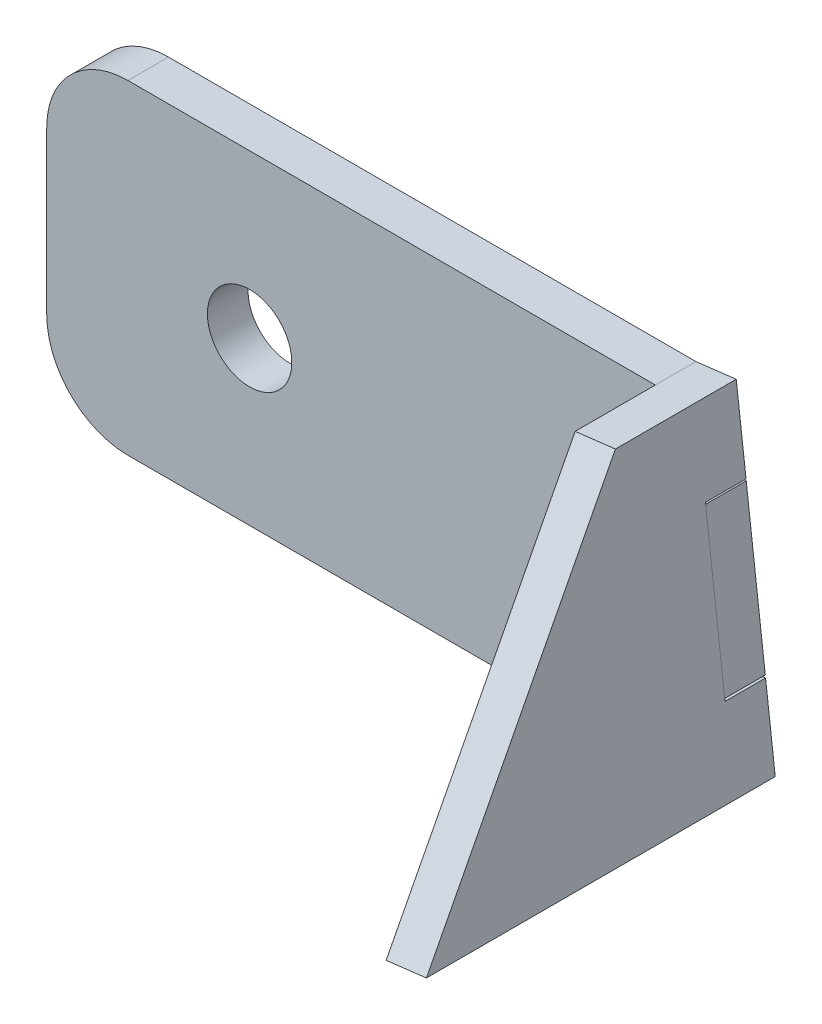
ISO-10303-21;
HEADER;
FILE_DESCRIPTION(('STEP AP214'),'2;1');
FILE_NAME('part.step','',(''),(''),'','','');
FILE_SCHEMA(('AUTOMOTIVE_DESIGN { 1 0 10303 214 1 1 1 1 }'));
ENDSEC;
DATA;
#1=APPLICATION_CONTEXT('core data for automotive mechanical design processes');
#2=APPLICATION_PROTOCOL_DEFINITION('international standard','automotive_design',2000,#1);
#3=PRODUCT_CONTEXT('',#1,'mechanical');
#4=PRODUCT('Part','Part','',(#3));
#5=PRODUCT_RELATED_PRODUCT_CATEGORY('part','',(#4));
#6=PRODUCT_DEFINITION_FORMATION('','',#4);
#7=PRODUCT_DEFINITION_CONTEXT('part definition',#1,'design');
#8=PRODUCT_DEFINITION('design','',#6,#7);
#9=PRODUCT_DEFINITION_SHAPE('','',#8);
#10=(LENGTH_UNIT() NAMED_UNIT(*) SI_UNIT(.MILLI.,.METRE.));
#11=(NAMED_UNIT(*) PLANE_ANGLE_UNIT() SI_UNIT($,.RADIAN.));
#12=(NAMED_UNIT(*) SI_UNIT($,.STERADIAN.) SOLID_ANGLE_UNIT());
#13=UNCERTAINTY_MEASURE_WITH_UNIT(LENGTH_MEASURE(1.E-05),#10,'distance_accuracy_value','');
#14=(GEOMETRIC_REPRESENTATION_CONTEXT(3) GLOBAL_UNCERTAINTY_ASSIGNED_CONTEXT((#13)) GLOBAL_UNIT_ASSIGNED_CONTEXT((#10,
#11,#12)) REPRESENTATION_CONTEXT('',''));
#15=CARTESIAN_POINT('',(0.,0.,0.));
#16=DIRECTION('',(0.,0.,1.));
#17=DIRECTION('',(1.,0.,0.));
#18=AXIS2_PLACEMENT_3D('',#15,#16,#17);
#19=CARTESIAN_POINT('',(1.50392222751671,0.180663088014956,3.175));
#20=DIRECTION('',(-0.992861803071718,-0.119270448985395,0.));
#21=DIRECTION('',(-0.119270448985395,0.992861803071718,0.));
#22=AXIS2_PLACEMENT_3D('',#19,#20,#21);
#23=PLANE('',#22);
#24=DIRECTION('',(0.119270448985395,-0.992861803071718,0.));
#25=VECTOR('',#24,1.);
#26=CARTESIAN_POINT('',(1.50392222751671,0.180663088014956,0.));
#27=LINE('',#26,#25);
#28=CARTESIAN_POINT('',(0.,12.7,0.));
#29=VERTEX_POINT('',#28);
#30=CARTESIAN_POINT('',(0.78008837158897,6.20618737700943,0.));
#31=VERTEX_POINT('',#30);
#32=EDGE_CURVE('E187',#29,#31,#27,.T.);
#33=ORIENTED_EDGE('',*,*,#32,.F.);
#34=DIRECTION('',(0.,0.,-1.));
#35=VECTOR('',#34,1.);
#36=CARTESIAN_POINT('',(0.,12.7,3.175));
#37=LINE('',#36,#35);
#38=CARTESIAN_POINT('',(0.,12.7,3.175));
#39=VERTEX_POINT('',#38);
#40=EDGE_CURVE('E161',#39,#29,#37,.T.);
#41=ORIENTED_EDGE('',*,*,#40,.F.);
#42=DIRECTION('',(0.119270448985395,-0.992861803071718,0.));
#43=VECTOR('',#42,1.);
#44=CARTESIAN_POINT('',(1.50392222751671,0.180663088014956,3.175));
#45=LINE('',#44,#43);
#46=CARTESIAN_POINT('',(0.78008837158897,6.20618737700943,3.175));
#47=VERTEX_POINT('',#46);
#48=EDGE_CURVE('E141',#39,#47,#45,.T.);
#49=ORIENTED_EDGE('',*,*,#48,.T.);
#50=DIRECTION('',(0.,0.,-1.));
#51=VECTOR('',#50,1.);
#52=CARTESIAN_POINT('',(0.78008837158897,6.20618737700943,3.175));
#53=LINE('',#52,#51);
#54=EDGE_CURVE('E150',#47,#31,#53,.T.);
#55=ORIENTED_EDGE('',*,*,#54,.T.);
#56=EDGE_LOOP('',(#33,#41,#49,#55));
#57=FACE_BOUND('',#56,.T.);
#58=ADVANCED_FACE('F61',(#57),#23,.F.);
#59=CARTESIAN_POINT('',(-0.723833855927744,6.02552428899448,3.175));
#60=DIRECTION('',(0.119270448985395,-0.992861803071718,0.));
#61=DIRECTION('',(-0.992861803071718,-0.119270448985395,0.));
#62=AXIS2_PLACEMENT_3D('',#59,#60,#61);
#63=PLANE('',#62);
#64=DIRECTION('',(0.992861803071718,0.119270448985395,0.));
#65=VECTOR('',#64,1.);
#66=CARTESIAN_POINT('',(-0.723833855927744,6.02552428899448,0.));
#67=LINE('',#66,#65);
#68=CARTESIAN_POINT('',(3.93242459634167,6.58487105253806,0.));
#69=VERTEX_POINT('',#68);
#70=EDGE_CURVE('E153',#31,#69,#67,.T.);
#71=ORIENTED_EDGE('',*,*,#70,.F.);
#72=ORIENTED_EDGE('',*,*,#54,.F.);
#73=DIRECTION('',(0.992861803071718,0.119270448985395,0.));
#74=VECTOR('',#73,1.);
#75=CARTESIAN_POINT('',(-0.723833855927744,6.02552428899448,3.175));
#76=LINE('',#75,#74);
#77=CARTESIAN_POINT('',(3.93242459634167,6.58487105253806,3.175));
#78=VERTEX_POINT('',#77);
#79=EDGE_CURVE('E136',#47,#78,#76,.T.);
#80=ORIENTED_EDGE('',*,*,#79,.T.);
#81=DIRECTION('',(0.,0.,-1.));
#82=VECTOR('',#81,1.);
#83=CARTESIAN_POINT('',(3.93242459634167,6.58487105253806,3.175));
#84=LINE('',#83,#82);
#85=EDGE_CURVE('E158',#78,#69,#84,.T.);
#86=ORIENTED_EDGE('',*,*,#85,.T.);
#87=EDGE_LOOP('',(#71,#72,#80,#86));
#88=FACE_BOUND('',#87,.T.);
#89=ADVANCED_FACE('F151',(#88),#63,.F.);
#90=CARTESIAN_POINT('',(4.65625845226941,0.559346763543586,3.175));
#91=DIRECTION('',(0.992861803071718,0.119270448985395,0.));
#92=DIRECTION('',(0.119270448985395,-0.992861803071718,0.));
#93=AXIS2_PLACEMENT_3D('',#90,#91,#92);
#94=PLANE('',#93);
#95=DIRECTION('',(-0.119270448985395,0.992861803071718,0.));
#96=VECTOR('',#95,1.);
#97=CARTESIAN_POINT('',(4.65625845226941,0.559346763543586,0.));
#98=LINE('',#97,#96);
#99=CARTESIAN_POINT('',(5.42349767953075,-5.8275037014808,0.));
#100=VERTEX_POINT('',#99);
#101=EDGE_CURVE('E205',#100,#69,#98,.T.);
#102=ORIENTED_EDGE('',*,*,#101,.T.);
#103=ORIENTED_EDGE('',*,*,#85,.F.);
#104=DIRECTION('',(-0.119270448985395,0.992861803071718,0.));
#105=VECTOR('',#104,1.);
#106=CARTESIAN_POINT('',(4.65625845226941,0.559346763543586,3.175));
#107=LINE('',#106,#105);
#108=CARTESIAN_POINT('',(5.42349767953075,-5.8275037014808,3.175));
#109=VERTEX_POINT('',#108);
#110=EDGE_CURVE('E144',#109,#78,#107,.T.);
#111=ORIENTED_EDGE('',*,*,#110,.F.);
#112=DIRECTION('',(0.,0.,-1.));
#113=VECTOR('',#112,1.);
#114=CARTESIAN_POINT('',(5.42349767953075,-5.8275037014808,3.175));
#115=LINE('',#114,#113);
#116=EDGE_CURVE('E294',#109,#100,#115,.T.);
#117=ORIENTED_EDGE('',*,*,#116,.T.);
#118=EDGE_LOOP('',(#102,#103,#111,#117));
#119=FACE_BOUND('',#118,.T.);
#120=ADVANCED_FACE('F273',(#119),#94,.T.);
#121=CARTESIAN_POINT('',(0.767239227261332,-6.38685046502439,3.175));
#122=DIRECTION('',(0.119270448985395,-0.992861803071718,0.));
#123=DIRECTION('',(-0.992861803071718,-0.119270448985395,0.));
#124=AXIS2_PLACEMENT_3D('',#121,#122,#123);
#125=PLANE('',#124);
#126=DIRECTION('',(0.992861803071718,0.119270448985395,0.));
#127=VECTOR('',#126,1.);
#128=CARTESIAN_POINT('',(0.767239227261332,-6.38685046502439,0.));
#129=LINE('',#128,#127);
#130=CARTESIAN_POINT('',(2.27116145477805,-6.20618737700943,0.));
#131=VERTEX_POINT('',#130);
#132=EDGE_CURVE('E202',#131,#100,#129,.T.);
#133=ORIENTED_EDGE('',*,*,#132,.T.);
#134=ORIENTED_EDGE('',*,*,#116,.F.);
#135=DIRECTION('',(0.992861803071718,0.119270448985395,0.));
#136=VECTOR('',#135,1.);
#137=CARTESIAN_POINT('',(0.767239227261332,-6.38685046502439,3.175));
#138=LINE('',#137,#136);
#139=CARTESIAN_POINT('',(2.27116145477805,-6.20618737700943,3.175));
#140=VERTEX_POINT('',#139);
#141=EDGE_CURVE('E172',#140,#109,#138,.T.);
#142=ORIENTED_EDGE('',*,*,#141,.F.);
#143=DIRECTION('',(0.,0.,-1.));
#144=VECTOR('',#143,1.);
#145=CARTESIAN_POINT('',(2.27116145477805,-6.20618737700943,3.175));
#146=LINE('',#145,#144);
#147=EDGE_CURVE('E288',#140,#131,#146,.T.);
#148=ORIENTED_EDGE('',*,*,#147,.T.);
#149=EDGE_LOOP('',(#133,#134,#142,#148));
#150=FACE_BOUND('',#149,.T.);
#151=ADVANCED_FACE('F279',(#150),#125,.T.);
#152=CARTESIAN_POINT('',(3.05124982636702,-12.7,0.));
#153=VERTEX_POINT('',#152);
#154=EDGE_CURVE('E192',#131,#153,#27,.T.);
#155=ORIENTED_EDGE('',*,*,#154,.F.);
#156=ORIENTED_EDGE('',*,*,#147,.F.);
#157=CARTESIAN_POINT('',(3.05124982636702,-12.7,3.175));
#158=VERTEX_POINT('',#157);
#159=EDGE_CURVE('E164',#140,#158,#45,.T.);
#160=ORIENTED_EDGE('',*,*,#159,.T.);
#161=DIRECTION('',(0.,0.,-1.));
#162=VECTOR('',#161,1.);
#163=CARTESIAN_POINT('',(3.05124982636702,-12.7,3.175));
#164=LINE('',#163,#162);
#165=EDGE_CURVE('E290',#158,#153,#164,.T.);
#166=ORIENTED_EDGE('',*,*,#165,.T.);
#167=EDGE_LOOP('',(#155,#156,#160,#166));
#168=FACE_BOUND('',#167,.T.);
#169=ADVANCED_FACE('F269',(#168),#23,.F.);
#170=CARTESIAN_POINT('',(0.,-12.7,3.175));
#171=DIRECTION('',(0.,1.,0.));
#172=DIRECTION('',(1.,0.,0.));
#173=AXIS2_PLACEMENT_3D('',#170,#171,#172);
#174=PLANE('',#173);
#175=DIRECTION('',(-1.,0.,0.));
#176=VECTOR('',#175,1.);
#177=CARTESIAN_POINT('',(0.,-12.7,0.));
#178=LINE('',#177,#176);
#179=CARTESIAN_POINT('',(-41.275,-12.7,0.));
#180=VERTEX_POINT('',#179);
#181=EDGE_CURVE('E207',#153,#180,#178,.T.);
#182=ORIENTED_EDGE('',*,*,#181,.F.);
#183=ORIENTED_EDGE('',*,*,#165,.F.);
#184=DIRECTION('',(-1.,0.,0.));
#185=VECTOR('',#184,1.);
#186=CARTESIAN_POINT('',(0.,-12.7,3.175));
#187=LINE('',#186,#185);
#188=CARTESIAN_POINT('',(-41.275,-12.7,3.175));
#189=VERTEX_POINT('',#188);
#190=EDGE_CURVE('E171',#158,#189,#187,.T.);
#191=ORIENTED_EDGE('',*,*,#190,.T.);
#192=DIRECTION('',(0.,0.,-1.));
#193=VECTOR('',#192,1.);
#194=CARTESIAN_POINT('',(-41.275,-12.7,3.175));
#195=LINE('',#194,#193);
#196=EDGE_CURVE('E257',#180,#189,#195,.F.);
#197=ORIENTED_EDGE('',*,*,#196,.F.);
#198=EDGE_LOOP('',(#182,#183,#191,#197));
#199=FACE_BOUND('',#198,.T.);
#200=ADVANCED_FACE('F278',(#199),#174,.F.);
#201=CARTESIAN_POINT('',(-47.625,0.,3.175));
#202=DIRECTION('',(-1.,0.,0.));
#203=DIRECTION('',(0.,0.,-1.));
#204=AXIS2_PLACEMENT_3D('',#201,#202,#203);
#205=PLANE('',#204);
#206=DIRECTION('',(0.,-1.,0.));
#207=VECTOR('',#206,1.);
#208=CARTESIAN_POINT('',(-47.625,0.,3.175));
#209=LINE('',#208,#207);
#210=CARTESIAN_POINT('',(-47.625,6.35,3.175));
#211=VERTEX_POINT('',#210);
#212=CARTESIAN_POINT('',(-47.625,-6.34999999999998,3.175));
#213=VERTEX_POINT('',#212);
#214=EDGE_CURVE('E177',#211,#213,#209,.T.);
#215=ORIENTED_EDGE('',*,*,#214,.F.);
#216=DIRECTION('',(0.,0.,-1.));
#217=VECTOR('',#216,1.);
#218=CARTESIAN_POINT('',(-47.625,6.35,3.175));
#219=LINE('',#218,#217);
#220=CARTESIAN_POINT('',(-47.625,6.35,0.));
#221=VERTEX_POINT('',#220);
#222=EDGE_CURVE('E157',#221,#211,#219,.F.);
#223=ORIENTED_EDGE('',*,*,#222,.F.);
#224=DIRECTION('',(0.,-1.,0.));
#225=VECTOR('',#224,1.);
#226=CARTESIAN_POINT('',(-47.625,0.,0.));
#227=LINE('',#226,#225);
#228=CARTESIAN_POINT('',(-47.625,-6.34999999999998,0.));
#229=VERTEX_POINT('',#228);
#230=EDGE_CURVE('E167',#221,#229,#227,.T.);
#231=ORIENTED_EDGE('',*,*,#230,.T.);
#232=DIRECTION('',(0.,0.,-1.));
#233=VECTOR('',#232,1.);
#234=CARTESIAN_POINT('',(-47.625,-6.34999999999998,0.));
#235=LINE('',#234,#233);
#236=EDGE_CURVE('E248',#213,#229,#235,.T.);
#237=ORIENTED_EDGE('',*,*,#236,.F.);
#238=EDGE_LOOP('',(#215,#223,#231,#237));
#239=FACE_BOUND('',#238,.T.);
#240=ADVANCED_FACE('F247',(#239),#205,.T.);
#241=CARTESIAN_POINT('',(0.,12.7,3.175));
#242=DIRECTION('',(0.,1.,0.));
#243=DIRECTION('',(0.,0.,1.));
#244=AXIS2_PLACEMENT_3D('',#241,#242,#243);
#245=PLANE('',#244);
#246=DIRECTION('',(-1.,0.,0.));
#247=VECTOR('',#246,1.);
#248=CARTESIAN_POINT('',(0.,12.7,3.175));
#249=LINE('',#248,#247);
#250=CARTESIAN_POINT('',(-41.275,12.7,3.175));
#251=VERTEX_POINT('',#250);
#252=EDGE_CURVE('E185',#39,#251,#249,.T.);
#253=ORIENTED_EDGE('',*,*,#252,.F.);
#254=ORIENTED_EDGE('',*,*,#40,.T.);
#255=DIRECTION('',(-1.,0.,0.));
#256=VECTOR('',#255,1.);
#257=CARTESIAN_POINT('',(0.,12.7,0.));
#258=LINE('',#257,#256);
#259=CARTESIAN_POINT('',(-41.275,12.7,0.));
#260=VERTEX_POINT('',#259);
#261=EDGE_CURVE('E162',#29,#260,#258,.T.);
#262=ORIENTED_EDGE('',*,*,#261,.T.);
#263=DIRECTION('',(0.,0.,-1.));
#264=VECTOR('',#263,1.);
#265=CARTESIAN_POINT('',(-41.275,12.7,3.175));
#266=LINE('',#265,#264);
#267=EDGE_CURVE('E13',#251,#260,#266,.T.);
#268=ORIENTED_EDGE('',*,*,#267,.F.);
#269=EDGE_LOOP('',(#253,#254,#262,#268));
#270=FACE_BOUND('',#269,.T.);
#271=ADVANCED_FACE('F262',(#270),#245,.T.);
#272=CARTESIAN_POINT('',(0.,0.,3.175));
#273=DIRECTION('',(0.,0.,1.));
#274=DIRECTION('',(-1.,0.,0.));
#275=AXIS2_PLACEMENT_3D('',#272,#273,#274);
#276=PLANE('',#275);
#277=CARTESIAN_POINT('',(-31.75,0.,3.175));
#278=DIRECTION('',(0.,0.,-1.));
#279=DIRECTION('',(-1.,0.,0.));
#280=AXIS2_PLACEMENT_3D('',#277,#278,#279);
#281=CIRCLE('',#280,3.30199999999999);
#282=CARTESIAN_POINT('',(-35.052,0.,3.175));
#283=VERTEX_POINT('',#282);
#284=EDGE_CURVE('E191',#283,#283,#281,.T.);
#285=ORIENTED_EDGE('',*,*,#284,.T.);
#286=EDGE_LOOP('',(#285));
#287=FACE_BOUND('',#286,.T.);
#288=ORIENTED_EDGE('',*,*,#190,.F.);
#289=ORIENTED_EDGE('',*,*,#159,.F.);
#290=ORIENTED_EDGE('',*,*,#141,.T.);
#291=ORIENTED_EDGE('',*,*,#110,.T.);
#292=ORIENTED_EDGE('',*,*,#79,.F.);
#293=ORIENTED_EDGE('',*,*,#48,.F.);
#294=ORIENTED_EDGE('',*,*,#252,.T.);
#295=CARTESIAN_POINT('',(-41.275,6.35,3.175));
#296=DIRECTION('',(0.,0.,-1.));
#297=DIRECTION('',(-1.,0.,0.));
#298=AXIS2_PLACEMENT_3D('',#295,#296,#297);
#299=CIRCLE('',#298,6.35);
#300=EDGE_CURVE('E75',#211,#251,#299,.T.);
#301=ORIENTED_EDGE('',*,*,#300,.F.);
#302=ORIENTED_EDGE('',*,*,#214,.T.);
#303=CARTESIAN_POINT('',(-41.275,-6.34999999999998,3.175));
#304=DIRECTION('',(0.,0.,-1.));
#305=DIRECTION('',(-1.,0.,0.));
#306=AXIS2_PLACEMENT_3D('',#303,#304,#305);
#307=CIRCLE('',#306,6.35);
#308=EDGE_CURVE('E69',#189,#213,#307,.T.);
#309=ORIENTED_EDGE('',*,*,#308,.F.);
#310=EDGE_LOOP('',(#288,#289,#290,#291,#292,#293,#294,#301,#302,#309));
#311=FACE_BOUND('',#310,.T.);
#312=ADVANCED_FACE('F138',(#287,#311),#276,.T.);
#313=CARTESIAN_POINT('',(0.,0.,0.));
#314=DIRECTION('',(0.,0.,1.));
#315=DIRECTION('',(-1.,0.,0.));
#316=AXIS2_PLACEMENT_3D('',#313,#314,#315);
#317=PLANE('',#316);
#318=CARTESIAN_POINT('',(-31.75,0.,0.));
#319=DIRECTION('',(0.,0.,-1.));
#320=DIRECTION('',(-1.,0.,0.));
#321=AXIS2_PLACEMENT_3D('',#318,#319,#320);
#322=CIRCLE('',#321,3.30199999999999);
#323=CARTESIAN_POINT('',(-35.052,0.,0.));
#324=VERTEX_POINT('',#323);
#325=EDGE_CURVE('E220',#324,#324,#322,.T.);
#326=ORIENTED_EDGE('',*,*,#325,.F.);
#327=EDGE_LOOP('',(#326));
#328=FACE_BOUND('',#327,.T.);
#329=ORIENTED_EDGE('',*,*,#230,.F.);
#330=CARTESIAN_POINT('',(-41.275,6.35,0.));
#331=DIRECTION('',(0.,0.,-1.));
#332=DIRECTION('',(-1.,0.,0.));
#333=AXIS2_PLACEMENT_3D('',#330,#331,#332);
#334=CIRCLE('',#333,6.35);
#335=EDGE_CURVE('E241',#260,#221,#334,.F.);
#336=ORIENTED_EDGE('',*,*,#335,.F.);
#337=ORIENTED_EDGE('',*,*,#261,.F.);
#338=ORIENTED_EDGE('',*,*,#32,.T.);
#339=ORIENTED_EDGE('',*,*,#70,.T.);
#340=ORIENTED_EDGE('',*,*,#101,.F.);
#341=ORIENTED_EDGE('',*,*,#132,.F.);
#342=ORIENTED_EDGE('',*,*,#154,.T.);
#343=ORIENTED_EDGE('',*,*,#181,.T.);
#344=CARTESIAN_POINT('',(-41.275,-6.34999999999998,0.));
#345=DIRECTION('',(0.,0.,-1.));
#346=DIRECTION('',(-1.,0.,0.));
#347=AXIS2_PLACEMENT_3D('',#344,#345,#346);
#348=CIRCLE('',#347,6.35);
#349=EDGE_CURVE('E242',#229,#180,#348,.F.);
#350=ORIENTED_EDGE('',*,*,#349,.F.);
#351=EDGE_LOOP('',(#329,#336,#337,#338,#339,#340,#341,#342,#343,#350));
#352=FACE_BOUND('',#351,.T.);
#353=ADVANCED_FACE('F232',(#328,#352),#317,.F.);
#354=CARTESIAN_POINT('',(-31.75,0.,0.));
#355=DIRECTION('',(0.,0.,1.));
#356=DIRECTION('',(-1.,0.,0.));
#357=AXIS2_PLACEMENT_3D('',#354,#355,#356);
#358=CYLINDRICAL_SURFACE('',#357,3.30199999999999);
#359=ORIENTED_EDGE('',*,*,#284,.F.);
#360=EDGE_LOOP('',(#359));
#361=FACE_BOUND('',#360,.T.);
#362=ORIENTED_EDGE('',*,*,#325,.T.);
#363=EDGE_LOOP('',(#362));
#364=FACE_BOUND('',#363,.T.);
#365=ADVANCED_FACE('F228',(#361,#364),#358,.F.);
#366=CARTESIAN_POINT('',(-41.275,-6.34999999999998,3.175));
#367=DIRECTION('',(0.,0.,1.));
#368=DIRECTION('',(-1.,0.,0.));
#369=AXIS2_PLACEMENT_3D('',#366,#367,#368);
#370=CYLINDRICAL_SURFACE('',#369,6.35);
#371=ORIENTED_EDGE('',*,*,#308,.T.);
#372=ORIENTED_EDGE('',*,*,#236,.T.);
#373=ORIENTED_EDGE('',*,*,#349,.T.);
#374=ORIENTED_EDGE('',*,*,#196,.T.);
#375=EDGE_LOOP('',(#371,#372,#373,#374));
#376=FACE_BOUND('',#375,.T.);
#377=ADVANCED_FACE('F231',(#376),#370,.T.);
#378=CARTESIAN_POINT('',(-41.275,6.35,3.175));
#379=DIRECTION('',(0.,0.,-1.));
#380=DIRECTION('',(1.,0.,0.));
#381=AXIS2_PLACEMENT_3D('',#378,#379,#380);
#382=CYLINDRICAL_SURFACE('',#381,6.35);
#383=ORIENTED_EDGE('',*,*,#300,.T.);
#384=ORIENTED_EDGE('',*,*,#267,.T.);
#385=ORIENTED_EDGE('',*,*,#335,.T.);
#386=ORIENTED_EDGE('',*,*,#222,.T.);
#387=EDGE_LOOP('',(#383,#384,#385,#386));
#388=FACE_BOUND('',#387,.T.);
#389=ADVANCED_FACE('F63',(#388),#382,.T.);
#390=CLOSED_SHELL('',(#58,#89,#120,#151,#169,#200,#240,#271,#312,#353,#365,#377,#389));
#391=MANIFOLD_SOLID_BREP('B2',#390);
#392=CARTESIAN_POINT('',(3.91727724932053,6.71096450152817,0.));
#393=DIRECTION('',(-0.119270448985395,0.992861803071718,0.));
#394=DIRECTION('',(0.992861803071718,0.119270448985395,0.));
#395=AXIS2_PLACEMENT_3D('',#392,#393,#394);
#396=PLANE('',#395);
#397=DIRECTION('',(0.,0.,1.));
#398=VECTOR('',#397,1.);
#399=CARTESIAN_POINT('',(0.764941024567826,6.33228082599954,0.));
#400=LINE('',#399,#398);
#401=CARTESIAN_POINT('',(0.764941024567826,6.33228082599954,0.));
#402=VERTEX_POINT('',#401);
#403=CARTESIAN_POINT('',(0.764941024567826,6.33228082599954,3.175));
#404=VERTEX_POINT('',#403);
#405=EDGE_CURVE('E521',#402,#404,#400,.T.);
#406=ORIENTED_EDGE('',*,*,#405,.F.);
#407=DIRECTION('',(-0.992861803071718,-0.119270448985395,0.));
#408=VECTOR('',#407,1.);
#409=CARTESIAN_POINT('',(3.91727724932053,6.71096450152817,0.));
#410=LINE('',#409,#408);
#411=CARTESIAN_POINT('',(3.91727724932053,6.71096450152817,0.));
#412=VERTEX_POINT('',#411);
#413=EDGE_CURVE('E520',#412,#402,#410,.T.);
#414=ORIENTED_EDGE('',*,*,#413,.F.);
#415=DIRECTION('',(0.,0.,1.));
#416=VECTOR('',#415,1.);
#417=CARTESIAN_POINT('',(3.91727724932053,6.71096450152817,0.));
#418=LINE('',#417,#416);
#419=CARTESIAN_POINT('',(3.91727724932053,6.71096450152817,3.175));
#420=VERTEX_POINT('',#419);
#421=EDGE_CURVE('E512',#412,#420,#418,.T.);
#422=ORIENTED_EDGE('',*,*,#421,.T.);
#423=DIRECTION('',(-0.992861803071718,-0.119270448985395,0.));
#424=VECTOR('',#423,1.);
#425=CARTESIAN_POINT('',(3.91727724932053,6.71096450152817,3.175));
#426=LINE('',#425,#424);
#427=EDGE_CURVE('E59',#420,#404,#426,.T.);
#428=ORIENTED_EDGE('',*,*,#427,.T.);
#429=EDGE_LOOP('',(#406,#414,#422,#428));
#430=FACE_BOUND('',#429,.T.);
#431=ADVANCED_FACE('F396',(#430),#396,.F.);
#432=CARTESIAN_POINT('',(4.65625845226942,0.559346763543586,3.175));
#433=DIRECTION('',(0.,0.,1.));
#434=DIRECTION('',(0.,-1.,0.));
#435=AXIS2_PLACEMENT_3D('',#432,#433,#434);
#436=PLANE('',#435);
#437=DIRECTION('',(0.119270448985395,-0.992861803071718,0.));
#438=VECTOR('',#437,1.);
#439=CARTESIAN_POINT('',(1.50392222751671,0.180663088014957,3.175));
#440=LINE('',#439,#438);
#441=CARTESIAN_POINT('',(2.29388247530976,-6.3953275504946,3.175));
#442=VERTEX_POINT('',#441);
#443=EDGE_CURVE('E523',#404,#442,#440,.T.);
#444=ORIENTED_EDGE('',*,*,#443,.F.);
#445=ORIENTED_EDGE('',*,*,#427,.F.);
#446=DIRECTION('',(0.119270448985395,-0.992861803071718,0.));
#447=VECTOR('',#446,1.);
#448=CARTESIAN_POINT('',(4.65625845226942,0.559346763543586,3.175));
#449=LINE('',#448,#447);
#450=CARTESIAN_POINT('',(5.44621870006247,-6.01664387496597,3.175));
#451=VERTEX_POINT('',#450);
#452=EDGE_CURVE('E450',#420,#451,#449,.T.);
#453=ORIENTED_EDGE('',*,*,#452,.T.);
#454=DIRECTION('',(-0.992861803071718,-0.119270448985395,0.));
#455=VECTOR('',#454,1.);
#456=CARTESIAN_POINT('',(5.44621870006247,-6.01664387496597,3.175));
#457=LINE('',#456,#455);
#458=EDGE_CURVE('E404',#451,#442,#457,.T.);
#459=ORIENTED_EDGE('',*,*,#458,.T.);
#460=EDGE_LOOP('',(#444,#445,#453,#459));
#461=FACE_BOUND('',#460,.T.);
#462=ADVANCED_FACE('F550',(#461),#436,.F.);
#463=CARTESIAN_POINT('',(5.44621870006247,-6.01664387496597,0.));
#464=DIRECTION('',(0.119270448985395,-0.992861803071718,0.));
#465=DIRECTION('',(-0.992861803071718,-0.119270448985395,0.));
#466=AXIS2_PLACEMENT_3D('',#463,#464,#465);
#467=PLANE('',#466);
#468=DIRECTION('',(0.,0.,-1.));
#469=VECTOR('',#468,1.);
#470=CARTESIAN_POINT('',(2.29388247530976,-6.39532755049459,0.));
#471=LINE('',#470,#469);
#472=CARTESIAN_POINT('',(2.29388247530976,-6.3953275504946,0.));
#473=VERTEX_POINT('',#472);
#474=EDGE_CURVE('E526',#442,#473,#471,.T.);
#475=ORIENTED_EDGE('',*,*,#474,.F.);
#476=ORIENTED_EDGE('',*,*,#458,.F.);
#477=DIRECTION('',(0.,0.,-1.));
#478=VECTOR('',#477,1.);
#479=CARTESIAN_POINT('',(5.44621870006247,-6.01664387496597,0.));
#480=LINE('',#479,#478);
#481=CARTESIAN_POINT('',(5.44621870006247,-6.01664387496597,0.));
#482=VERTEX_POINT('',#481);
#483=EDGE_CURVE('E505',#451,#482,#480,.T.);
#484=ORIENTED_EDGE('',*,*,#483,.T.);
#485=DIRECTION('',(-0.992861803071718,-0.119270448985395,0.));
#486=VECTOR('',#485,1.);
#487=CARTESIAN_POINT('',(5.44621870006247,-6.01664387496597,0.));
#488=LINE('',#487,#486);
#489=EDGE_CURVE('E545',#482,#473,#488,.T.);
#490=ORIENTED_EDGE('',*,*,#489,.T.);
#491=EDGE_LOOP('',(#475,#476,#484,#490));
#492=FACE_BOUND('',#491,.T.);
#493=ADVANCED_FACE('F570',(#492),#467,.F.);
#494=CARTESIAN_POINT('',(4.65625845226942,0.559346763543585,0.));
#495=DIRECTION('',(0.,0.,1.));
#496=DIRECTION('',(-1.,0.,0.));
#497=AXIS2_PLACEMENT_3D('',#494,#495,#496);
#498=PLANE('',#497);
#499=DIRECTION('',(0.119270448985395,-0.992861803071718,0.));
#500=VECTOR('',#499,1.);
#501=CARTESIAN_POINT('',(1.50392222751671,0.180663088014956,0.));
#502=LINE('',#501,#500);
#503=CARTESIAN_POINT('',(3.05124982636702,-12.7,0.));
#504=VERTEX_POINT('',#503);
#505=EDGE_CURVE('E529',#473,#504,#502,.T.);
#506=ORIENTED_EDGE('',*,*,#505,.F.);
#507=ORIENTED_EDGE('',*,*,#489,.F.);
#508=DIRECTION('',(0.119270448985395,-0.992861803071718,0.));
#509=VECTOR('',#508,1.);
#510=CARTESIAN_POINT('',(4.65625845226942,0.559346763543585,0.));
#511=LINE('',#510,#509);
#512=CARTESIAN_POINT('',(6.20358605111973,-12.3213163244714,0.));
#513=VERTEX_POINT('',#512);
#514=EDGE_CURVE('E489',#482,#513,#511,.T.);
#515=ORIENTED_EDGE('',*,*,#514,.T.);
#516=DIRECTION('',(-0.992861803071718,-0.119270448985395,0.));
#517=VECTOR('',#516,1.);
#518=CARTESIAN_POINT('',(6.20358605111973,-12.3213163244714,0.));
#519=LINE('',#518,#517);
#520=EDGE_CURVE('E542',#513,#504,#519,.T.);
#521=ORIENTED_EDGE('',*,*,#520,.T.);
#522=EDGE_LOOP('',(#506,#507,#515,#521));
#523=FACE_BOUND('',#522,.T.);
#524=ADVANCED_FACE('F574',(#523),#498,.F.);
#525=CARTESIAN_POINT('',(6.20358605111973,-12.3213163244714,0.));
#526=DIRECTION('',(-0.119270448985395,0.992861803071718,0.));
#527=DIRECTION('',(0.992861803071718,0.119270448985395,0.));
#528=AXIS2_PLACEMENT_3D('',#525,#526,#527);
#529=PLANE('',#528);
#530=DIRECTION('',(0.,0.,1.));
#531=VECTOR('',#530,1.);
#532=CARTESIAN_POINT('',(3.05124982636702,-12.7,0.));
#533=LINE('',#532,#531);
#534=CARTESIAN_POINT('',(3.05124982636702,-12.7,27.2953089126241));
#535=VERTEX_POINT('',#534);
#536=EDGE_CURVE('E532',#504,#535,#533,.T.);
#537=ORIENTED_EDGE('',*,*,#536,.F.);
#538=ORIENTED_EDGE('',*,*,#520,.F.);
#539=DIRECTION('',(0.,0.,1.));
#540=VECTOR('',#539,1.);
#541=CARTESIAN_POINT('',(6.20358605111973,-12.3213163244714,0.));
#542=LINE('',#541,#540);
#543=CARTESIAN_POINT('',(6.20358605111973,-12.3213163244714,27.2953089126241));
#544=VERTEX_POINT('',#543);
#545=EDGE_CURVE('E486',#513,#544,#542,.T.);
#546=ORIENTED_EDGE('',*,*,#545,.T.);
#547=DIRECTION('',(-0.992861803071718,-0.119270448985395,0.));
#548=VECTOR('',#547,1.);
#549=CARTESIAN_POINT('',(6.20358605111973,-12.3213163244714,27.2953089126241));
#550=LINE('',#549,#548);
#551=EDGE_CURVE('E479',#544,#535,#550,.T.);
#552=ORIENTED_EDGE('',*,*,#551,.T.);
#553=EDGE_LOOP('',(#537,#538,#546,#552));
#554=FACE_BOUND('',#553,.T.);
#555=ADVANCED_FACE('F579',(#554),#529,.F.);
#556=CARTESIAN_POINT('',(3.63508992450489,9.06002094009953,12.276588008054));
#557=DIRECTION('',(-0.0682268201061862,0.567951275481261,0.820229510379508));
#558=DIRECTION('',(0.,-0.822145243895806,0.569277786269151));
#559=AXIS2_PLACEMENT_3D('',#556,#557,#558);
#560=PLANE('',#559);
#561=DIRECTION('',(0.0978291419740346,-0.81437455060803,0.572034570898117));
#562=VECTOR('',#561,1.);
#563=CARTESIAN_POINT('',(0.482753699752187,8.6813372645709,12.276588008054));
#564=LINE('',#563,#562);
#565=CARTESIAN_POINT('',(0.,12.7,9.45379103861392));
#566=VERTEX_POINT('',#565);
#567=EDGE_CURVE('E535',#566,#535,#564,.T.);
#568=ORIENTED_EDGE('',*,*,#567,.T.);
#569=ORIENTED_EDGE('',*,*,#551,.F.);
#570=DIRECTION('',(0.0978291419740346,-0.81437455060803,0.572034570898117));
#571=VECTOR('',#570,1.);
#572=CARTESIAN_POINT('',(3.63508992450489,9.06002094009953,12.276588008054));
#573=LINE('',#572,#571);
#574=CARTESIAN_POINT('',(3.1523362247527,13.0786836755286,9.45379103861392));
#575=VERTEX_POINT('',#574);
#576=EDGE_CURVE('E468',#575,#544,#573,.T.);
#577=ORIENTED_EDGE('',*,*,#576,.F.);
#578=DIRECTION('',(-0.992861803071718,-0.119270448985395,0.));
#579=VECTOR('',#578,1.);
#580=CARTESIAN_POINT('',(3.1523362247527,13.0786836755286,9.45379103861392));
#581=LINE('',#580,#579);
#582=EDGE_CURVE('E474',#575,#566,#581,.T.);
#583=ORIENTED_EDGE('',*,*,#582,.T.);
#584=EDGE_LOOP('',(#568,#569,#577,#583));
#585=FACE_BOUND('',#584,.T.);
#586=ADVANCED_FACE('F482',(#585),#560,.T.);
#587=CARTESIAN_POINT('',(3.1523362247527,13.0786836755286,0.));
#588=DIRECTION('',(-0.119270448985395,0.992861803071718,0.));
#589=DIRECTION('',(0.992861803071718,0.119270448985395,0.));
#590=AXIS2_PLACEMENT_3D('',#587,#588,#589);
#591=PLANE('',#590);
#592=DIRECTION('',(0.,0.,1.));
#593=VECTOR('',#592,1.);
#594=CARTESIAN_POINT('',(0.,12.7,0.));
#595=LINE('',#594,#593);
#596=CARTESIAN_POINT('',(0.,12.7,0.));
#597=VERTEX_POINT('',#596);
#598=EDGE_CURVE('E476',#597,#566,#595,.T.);
#599=ORIENTED_EDGE('',*,*,#598,.T.);
#600=ORIENTED_EDGE('',*,*,#582,.F.);
#601=DIRECTION('',(0.,0.,1.));
#602=VECTOR('',#601,1.);
#603=CARTESIAN_POINT('',(3.1523362247527,13.0786836755286,0.));
#604=LINE('',#603,#602);
#605=CARTESIAN_POINT('',(3.1523362247527,13.0786836755286,0.));
#606=VERTEX_POINT('',#605);
#607=EDGE_CURVE('E464',#606,#575,#604,.T.);
#608=ORIENTED_EDGE('',*,*,#607,.F.);
#609=DIRECTION('',(-0.992861803071718,-0.119270448985395,0.));
#610=VECTOR('',#609,1.);
#611=CARTESIAN_POINT('',(3.1523362247527,13.0786836755286,0.));
#612=LINE('',#611,#610);
#613=EDGE_CURVE('E480',#606,#597,#612,.T.);
#614=ORIENTED_EDGE('',*,*,#613,.T.);
#615=EDGE_LOOP('',(#599,#600,#608,#614));
#616=FACE_BOUND('',#615,.T.);
#617=ADVANCED_FACE('F475',(#616),#591,.T.);
#618=CARTESIAN_POINT('',(4.65625845226942,0.559346763543585,0.));
#619=DIRECTION('',(0.,0.,1.));
#620=DIRECTION('',(-1.,0.,0.));
#621=AXIS2_PLACEMENT_3D('',#618,#619,#620);
#622=PLANE('',#621);
#623=DIRECTION('',(0.119270448985395,-0.992861803071718,0.));
#624=VECTOR('',#623,1.);
#625=CARTESIAN_POINT('',(1.50392222751671,0.180663088014956,0.));
#626=LINE('',#625,#624);
#627=EDGE_CURVE('E438',#597,#402,#626,.T.);
#628=ORIENTED_EDGE('',*,*,#627,.F.);
#629=ORIENTED_EDGE('',*,*,#613,.F.);
#630=DIRECTION('',(0.119270448985395,-0.992861803071718,0.));
#631=VECTOR('',#630,1.);
#632=CARTESIAN_POINT('',(4.65625845226942,0.559346763543585,0.));
#633=LINE('',#632,#631);
#634=EDGE_CURVE('E412',#606,#412,#633,.T.);
#635=ORIENTED_EDGE('',*,*,#634,.T.);
#636=ORIENTED_EDGE('',*,*,#413,.T.);
#637=EDGE_LOOP('',(#628,#629,#635,#636));
#638=FACE_BOUND('',#637,.T.);
#639=ADVANCED_FACE('F556',(#638),#622,.F.);
#640=CARTESIAN_POINT('',(4.65625845226942,0.559346763543585,0.));
#641=DIRECTION('',(0.992861803071718,0.119270448985395,0.));
#642=DIRECTION('',(0.119270448985395,-0.992861803071718,0.));
#643=AXIS2_PLACEMENT_3D('',#640,#641,#642);
#644=PLANE('',#643);
#645=ORIENTED_EDGE('',*,*,#421,.F.);
#646=ORIENTED_EDGE('',*,*,#634,.F.);
#647=ORIENTED_EDGE('',*,*,#607,.T.);
#648=ORIENTED_EDGE('',*,*,#576,.T.);
#649=ORIENTED_EDGE('',*,*,#545,.F.);
#650=ORIENTED_EDGE('',*,*,#514,.F.);
#651=ORIENTED_EDGE('',*,*,#483,.F.);
#652=ORIENTED_EDGE('',*,*,#452,.F.);
#653=EDGE_LOOP('',(#645,#646,#647,#648,#649,#650,#651,#652));
#654=FACE_BOUND('',#653,.T.);
#655=ADVANCED_FACE('F466',(#654),#644,.T.);
#656=CARTESIAN_POINT('',(1.50392222751671,0.180663088014956,0.));
#657=DIRECTION('',(0.992861803071718,0.119270448985395,0.));
#658=DIRECTION('',(0.119270448985395,-0.992861803071718,0.));
#659=AXIS2_PLACEMENT_3D('',#656,#657,#658);
#660=PLANE('',#659);
#661=ORIENTED_EDGE('',*,*,#405,.T.);
#662=ORIENTED_EDGE('',*,*,#443,.T.);
#663=ORIENTED_EDGE('',*,*,#474,.T.);
#664=ORIENTED_EDGE('',*,*,#505,.T.);
#665=ORIENTED_EDGE('',*,*,#536,.T.);
#666=ORIENTED_EDGE('',*,*,#567,.F.);
#667=ORIENTED_EDGE('',*,*,#598,.F.);
#668=ORIENTED_EDGE('',*,*,#627,.T.);
#669=EDGE_LOOP('',(#661,#662,#663,#664,#665,#666,#667,#668));
#670=FACE_BOUND('',#669,.T.);
#671=ADVANCED_FACE('F552',(#670),#660,.F.);
#672=CLOSED_SHELL('',(#431,#462,#493,#524,#555,#586,#617,#639,#655,#671));
#673=MANIFOLD_SOLID_BREP('B7',#672);
#674=ADVANCED_BREP_SHAPE_REPRESENTATION('',(#18,#391,#673),#14);
#675=SHAPE_DEFINITION_REPRESENTATION(#9,#674);
ENDSEC;
END-ISO-10303-21;
